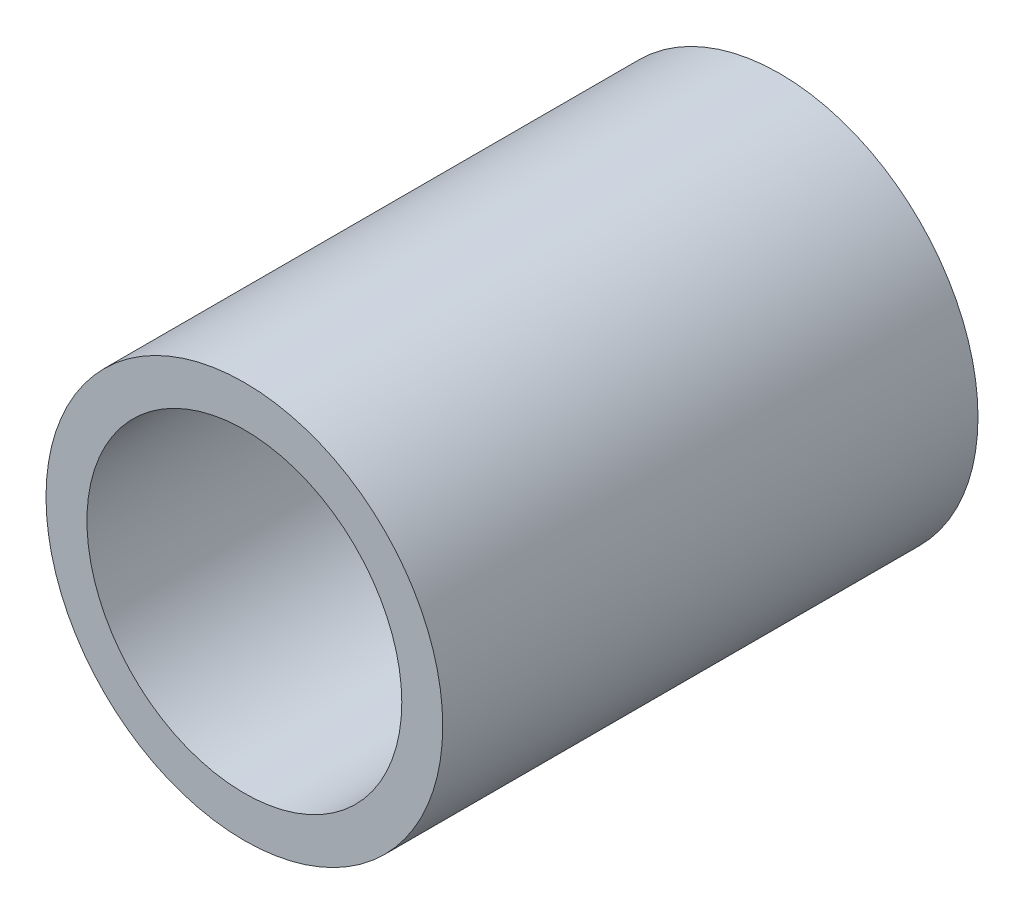
ISO-10303-21;
HEADER;
FILE_DESCRIPTION(('STEP AP214'),'2;1');
FILE_NAME('part.step','',(''),(''),'','','');
FILE_SCHEMA(('AUTOMOTIVE_DESIGN { 1 0 10303 214 1 1 1 1 }'));
ENDSEC;
DATA;
#1=APPLICATION_CONTEXT('core data for automotive mechanical design processes');
#2=APPLICATION_PROTOCOL_DEFINITION('international standard','automotive_design',2000,#1);
#3=PRODUCT_CONTEXT('',#1,'mechanical');
#4=PRODUCT('Part','Part','',(#3));
#5=PRODUCT_RELATED_PRODUCT_CATEGORY('part','',(#4));
#6=PRODUCT_DEFINITION_FORMATION('','',#4);
#7=PRODUCT_DEFINITION_CONTEXT('part definition',#1,'design');
#8=PRODUCT_DEFINITION('design','',#6,#7);
#9=PRODUCT_DEFINITION_SHAPE('','',#8);
#10=(LENGTH_UNIT() NAMED_UNIT(*) SI_UNIT(.MILLI.,.METRE.));
#11=(NAMED_UNIT(*) PLANE_ANGLE_UNIT() SI_UNIT($,.RADIAN.));
#12=(NAMED_UNIT(*) SI_UNIT($,.STERADIAN.) SOLID_ANGLE_UNIT());
#13=UNCERTAINTY_MEASURE_WITH_UNIT(LENGTH_MEASURE(1.E-05),#10,'distance_accuracy_value','');
#14=(GEOMETRIC_REPRESENTATION_CONTEXT(3) GLOBAL_UNCERTAINTY_ASSIGNED_CONTEXT((#13)) GLOBAL_UNIT_ASSIGNED_CONTEXT((#10,
#11,#12)) REPRESENTATION_CONTEXT('',''));
#15=CARTESIAN_POINT('',(0.,0.,0.));
#16=DIRECTION('',(0.,0.,1.));
#17=DIRECTION('',(1.,0.,0.));
#18=AXIS2_PLACEMENT_3D('',#15,#16,#17);
#19=CARTESIAN_POINT('',(0.,0.,17.));
#20=DIRECTION('',(0.,0.,1.));
#21=DIRECTION('',(1.,0.,0.));
#22=AXIS2_PLACEMENT_3D('',#19,#20,#21);
#23=PLANE('',#22);
#24=CARTESIAN_POINT('',(0.,0.,17.));
#25=DIRECTION('',(0.,0.,1.));
#26=DIRECTION('',(1.,0.,0.));
#27=AXIS2_PLACEMENT_3D('',#24,#25,#26);
#28=CIRCLE('',#27,6.3);
#29=CARTESIAN_POINT('',(6.3,0.,17.));
#30=VERTEX_POINT('',#29);
#31=EDGE_CURVE('E10',#30,#30,#28,.T.);
#32=ORIENTED_EDGE('',*,*,#31,.T.);
#33=EDGE_LOOP('',(#32));
#34=FACE_BOUND('',#33,.T.);
#35=CARTESIAN_POINT('',(0.,0.,17.));
#36=DIRECTION('',(0.,0.,1.));
#37=DIRECTION('',(1.,0.,0.));
#38=AXIS2_PLACEMENT_3D('',#35,#36,#37);
#39=CIRCLE('',#38,5.);
#40=CARTESIAN_POINT('',(5.,0.,17.));
#41=VERTEX_POINT('',#40);
#42=EDGE_CURVE('E54',#41,#41,#39,.T.);
#43=ORIENTED_EDGE('',*,*,#42,.F.);
#44=EDGE_LOOP('',(#43));
#45=FACE_BOUND('',#44,.T.);
#46=ADVANCED_FACE('F41',(#34,#45),#23,.T.);
#47=CARTESIAN_POINT('',(0.,0.,0.));
#48=DIRECTION('',(0.,0.,1.));
#49=DIRECTION('',(1.,0.,0.));
#50=AXIS2_PLACEMENT_3D('',#47,#48,#49);
#51=PLANE('',#50);
#52=CARTESIAN_POINT('',(0.,0.,0.));
#53=DIRECTION('',(0.,0.,1.));
#54=DIRECTION('',(1.,0.,0.));
#55=AXIS2_PLACEMENT_3D('',#52,#53,#54);
#56=CIRCLE('',#55,6.3);
#57=CARTESIAN_POINT('',(6.3,0.,0.));
#58=VERTEX_POINT('',#57);
#59=EDGE_CURVE('E45',#58,#58,#56,.T.);
#60=ORIENTED_EDGE('',*,*,#59,.F.);
#61=EDGE_LOOP('',(#60));
#62=FACE_BOUND('',#61,.T.);
#63=CARTESIAN_POINT('',(0.,0.,0.));
#64=DIRECTION('',(0.,0.,1.));
#65=DIRECTION('',(1.,0.,0.));
#66=AXIS2_PLACEMENT_3D('',#63,#64,#65);
#67=CIRCLE('',#66,5.);
#68=CARTESIAN_POINT('',(5.,0.,0.));
#69=VERTEX_POINT('',#68);
#70=EDGE_CURVE('E56',#69,#69,#67,.T.);
#71=ORIENTED_EDGE('',*,*,#70,.T.);
#72=EDGE_LOOP('',(#71));
#73=FACE_BOUND('',#72,.T.);
#74=ADVANCED_FACE('F68',(#62,#73),#51,.F.);
#75=CARTESIAN_POINT('',(0.,0.,17.));
#76=DIRECTION('',(0.,0.,-1.));
#77=DIRECTION('',(-1.,0.,0.));
#78=AXIS2_PLACEMENT_3D('',#75,#76,#77);
#79=CYLINDRICAL_SURFACE('',#78,6.3);
#80=ORIENTED_EDGE('',*,*,#31,.F.);
#81=EDGE_LOOP('',(#80));
#82=FACE_BOUND('',#81,.T.);
#83=ORIENTED_EDGE('',*,*,#59,.T.);
#84=EDGE_LOOP('',(#83));
#85=FACE_BOUND('',#84,.T.);
#86=ADVANCED_FACE('F43',(#82,#85),#79,.T.);
#87=CARTESIAN_POINT('',(0.,0.,17.));
#88=DIRECTION('',(0.,0.,-1.));
#89=DIRECTION('',(-1.,0.,0.));
#90=AXIS2_PLACEMENT_3D('',#87,#88,#89);
#91=CYLINDRICAL_SURFACE('',#90,5.);
#92=ORIENTED_EDGE('',*,*,#42,.T.);
#93=EDGE_LOOP('',(#92));
#94=FACE_BOUND('',#93,.T.);
#95=ORIENTED_EDGE('',*,*,#70,.F.);
#96=EDGE_LOOP('',(#95));
#97=FACE_BOUND('',#96,.T.);
#98=ADVANCED_FACE('F64',(#94,#97),#91,.F.);
#99=CLOSED_SHELL('',(#46,#74,#86,#98));
#100=MANIFOLD_SOLID_BREP('B2',#99);
#101=ADVANCED_BREP_SHAPE_REPRESENTATION('',(#18,#100),#14);
#102=SHAPE_DEFINITION_REPRESENTATION(#9,#101);
ENDSEC;
END-ISO-10303-21;
